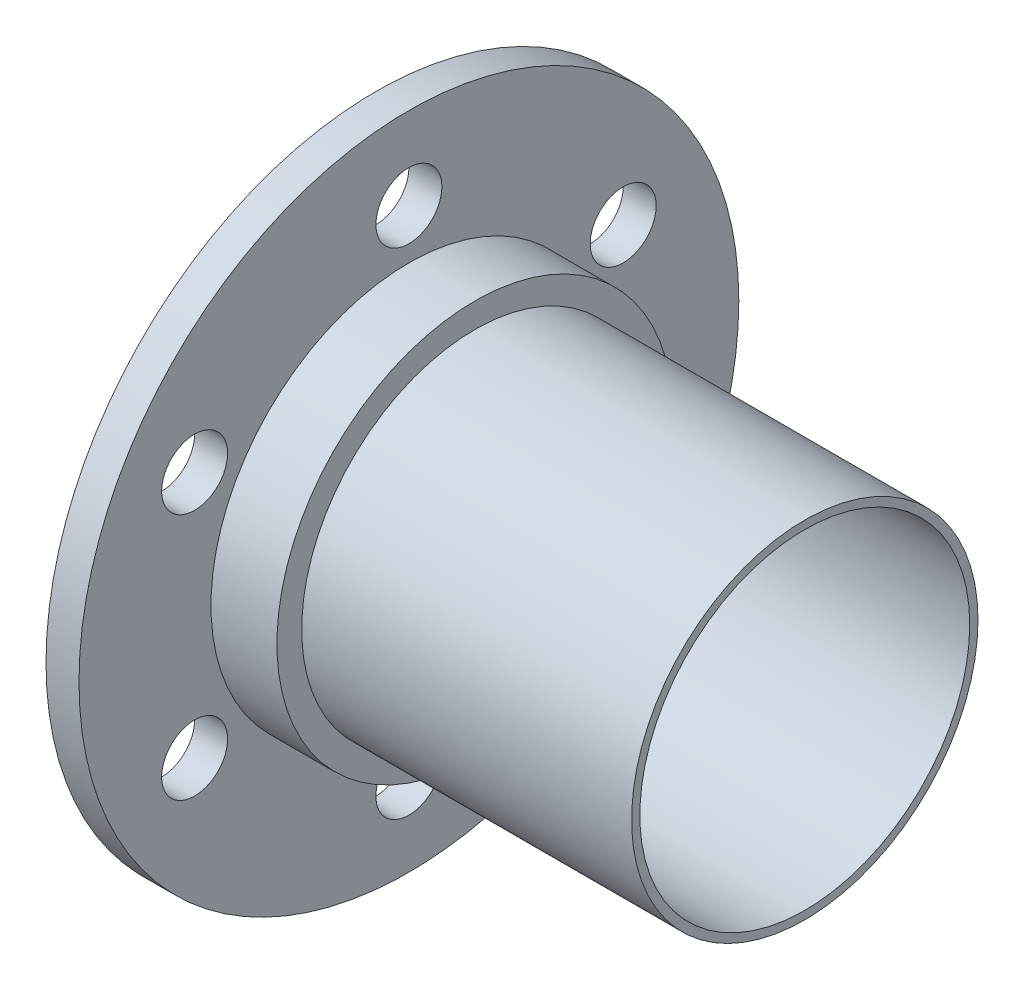
ISO-10303-21;
HEADER;
FILE_DESCRIPTION(('STEP AP214'),'2;1');
FILE_NAME('part.step','',(''),(''),'','','');
FILE_SCHEMA(('AUTOMOTIVE_DESIGN { 1 0 10303 214 1 1 1 1 }'));
ENDSEC;
DATA;
#1=APPLICATION_CONTEXT('core data for automotive mechanical design processes');
#2=APPLICATION_PROTOCOL_DEFINITION('international standard','automotive_design',2000,#1);
#3=PRODUCT_CONTEXT('',#1,'mechanical');
#4=PRODUCT('Part','Part','',(#3));
#5=PRODUCT_RELATED_PRODUCT_CATEGORY('part','',(#4));
#6=PRODUCT_DEFINITION_FORMATION('','',#4);
#7=PRODUCT_DEFINITION_CONTEXT('part definition',#1,'design');
#8=PRODUCT_DEFINITION('design','',#6,#7);
#9=PRODUCT_DEFINITION_SHAPE('','',#8);
#10=(LENGTH_UNIT() NAMED_UNIT(*) SI_UNIT(.MILLI.,.METRE.));
#11=(NAMED_UNIT(*) PLANE_ANGLE_UNIT() SI_UNIT($,.RADIAN.));
#12=(NAMED_UNIT(*) SI_UNIT($,.STERADIAN.) SOLID_ANGLE_UNIT());
#13=UNCERTAINTY_MEASURE_WITH_UNIT(LENGTH_MEASURE(1.E-05),#10,'distance_accuracy_value','');
#14=(GEOMETRIC_REPRESENTATION_CONTEXT(3) GLOBAL_UNCERTAINTY_ASSIGNED_CONTEXT((#13)) GLOBAL_UNIT_ASSIGNED_CONTEXT((#10,
#11,#12)) REPRESENTATION_CONTEXT('',''));
#15=CARTESIAN_POINT('',(0.,0.,0.));
#16=DIRECTION('',(0.,0.,1.));
#17=DIRECTION('',(1.,0.,0.));
#18=AXIS2_PLACEMENT_3D('',#15,#16,#17);
#19=CARTESIAN_POINT('',(120.,0.,0.));
#20=DIRECTION('',(1.,0.,0.));
#21=DIRECTION('',(0.,0.,-1.));
#22=AXIS2_PLACEMENT_3D('',#19,#20,#21);
#23=PLANE('',#22);
#24=CARTESIAN_POINT('',(120.,0.,0.));
#25=DIRECTION('',(1.,0.,0.));
#26=DIRECTION('',(0.,0.,-1.));
#27=AXIS2_PLACEMENT_3D('',#24,#25,#26);
#28=CIRCLE('',#27,52.5);
#29=CARTESIAN_POINT('',(120.,0.,-52.5));
#30=VERTEX_POINT('',#29);
#31=EDGE_CURVE('E11',#30,#30,#28,.T.);
#32=ORIENTED_EDGE('',*,*,#31,.T.);
#33=EDGE_LOOP('',(#32));
#34=FACE_BOUND('',#33,.T.);
#35=CARTESIAN_POINT('',(120.,0.,0.));
#36=DIRECTION('',(1.,0.,0.));
#37=DIRECTION('',(0.,0.,-1.));
#38=AXIS2_PLACEMENT_3D('',#35,#36,#37);
#39=CIRCLE('',#38,50.);
#40=CARTESIAN_POINT('',(120.,0.,-50.));
#41=VERTEX_POINT('',#40);
#42=EDGE_CURVE('E54',#41,#41,#39,.T.);
#43=ORIENTED_EDGE('',*,*,#42,.F.);
#44=EDGE_LOOP('',(#43));
#45=FACE_BOUND('',#44,.T.);
#46=ADVANCED_FACE('F43',(#34,#45),#23,.T.);
#47=CARTESIAN_POINT('',(20.,0.,0.));
#48=DIRECTION('',(1.,0.,0.));
#49=DIRECTION('',(0.,0.,-1.));
#50=AXIS2_PLACEMENT_3D('',#47,#48,#49);
#51=PLANE('',#50);
#52=CARTESIAN_POINT('',(20.,0.,0.));
#53=DIRECTION('',(1.,0.,0.));
#54=DIRECTION('',(0.,0.,-1.));
#55=AXIS2_PLACEMENT_3D('',#52,#53,#54);
#56=CIRCLE('',#55,52.5);
#57=CARTESIAN_POINT('',(20.,0.,-52.5));
#58=VERTEX_POINT('',#57);
#59=EDGE_CURVE('E47',#58,#58,#56,.T.);
#60=ORIENTED_EDGE('',*,*,#59,.F.);
#61=EDGE_LOOP('',(#60));
#62=FACE_BOUND('',#61,.T.);
#63=CARTESIAN_POINT('',(20.,0.,0.));
#64=DIRECTION('',(1.,0.,0.));
#65=DIRECTION('',(0.,0.,-1.));
#66=AXIS2_PLACEMENT_3D('',#63,#64,#65);
#67=CIRCLE('',#66,50.);
#68=CARTESIAN_POINT('',(20.,0.,-50.));
#69=VERTEX_POINT('',#68);
#70=EDGE_CURVE('E56',#69,#69,#67,.T.);
#71=ORIENTED_EDGE('',*,*,#70,.T.);
#72=EDGE_LOOP('',(#71));
#73=FACE_BOUND('',#72,.T.);
#74=ADVANCED_FACE('F66',(#62,#73),#51,.F.);
#75=CARTESIAN_POINT('',(120.,0.,0.));
#76=DIRECTION('',(-1.,0.,0.));
#77=DIRECTION('',(0.,0.,1.));
#78=AXIS2_PLACEMENT_3D('',#75,#76,#77);
#79=CYLINDRICAL_SURFACE('',#78,52.5);
#80=ORIENTED_EDGE('',*,*,#31,.F.);
#81=EDGE_LOOP('',(#80));
#82=FACE_BOUND('',#81,.T.);
#83=ORIENTED_EDGE('',*,*,#59,.T.);
#84=EDGE_LOOP('',(#83));
#85=FACE_BOUND('',#84,.T.);
#86=ADVANCED_FACE('F45',(#82,#85),#79,.T.);
#87=CARTESIAN_POINT('',(120.,0.,0.));
#88=DIRECTION('',(-1.,0.,0.));
#89=DIRECTION('',(0.,0.,1.));
#90=AXIS2_PLACEMENT_3D('',#87,#88,#89);
#91=CYLINDRICAL_SURFACE('',#90,50.);
#92=ORIENTED_EDGE('',*,*,#42,.T.);
#93=EDGE_LOOP('',(#92));
#94=FACE_BOUND('',#93,.T.);
#95=ORIENTED_EDGE('',*,*,#70,.F.);
#96=EDGE_LOOP('',(#95));
#97=FACE_BOUND('',#96,.T.);
#98=ADVANCED_FACE('F62',(#94,#97),#91,.F.);
#99=CLOSED_SHELL('',(#46,#74,#86,#98));
#100=MANIFOLD_SOLID_BREP('B2',#99);
#101=CARTESIAN_POINT('',(0.,0.,0.));
#102=DIRECTION('',(1.,0.,0.));
#103=DIRECTION('',(0.,0.,-1.));
#104=AXIS2_PLACEMENT_3D('',#101,#102,#103);
#105=PLANE('',#104);
#106=CARTESIAN_POINT('',(0.,0.,0.));
#107=DIRECTION('',(1.,0.,0.));
#108=DIRECTION('',(0.,0.,-1.));
#109=AXIS2_PLACEMENT_3D('',#106,#107,#108);
#110=CIRCLE('',#109,100.);
#111=CARTESIAN_POINT('',(0.,0.,-100.));
#112=VERTEX_POINT('',#111);
#113=EDGE_CURVE('E117',#112,#112,#110,.T.);
#114=ORIENTED_EDGE('',*,*,#113,.T.);
#115=EDGE_LOOP('',(#114));
#116=FACE_BOUND('',#115,.T.);
#117=CARTESIAN_POINT('',(0.,75.,0.));
#118=DIRECTION('',(1.,0.,0.));
#119=DIRECTION('',(0.,0.,-1.));
#120=AXIS2_PLACEMENT_3D('',#117,#118,#119);
#121=CIRCLE('',#120,10.);
#122=CARTESIAN_POINT('',(0.,75.,-10.));
#123=VERTEX_POINT('',#122);
#124=EDGE_CURVE('E129',#123,#123,#121,.T.);
#125=ORIENTED_EDGE('',*,*,#124,.F.);
#126=EDGE_LOOP('',(#125));
#127=FACE_BOUND('',#126,.T.);
#128=CARTESIAN_POINT('',(0.,37.5000000000028,-64.9519052838345));
#129=DIRECTION('',(1.,0.,0.));
#130=DIRECTION('',(0.,0.,-1.));
#131=AXIS2_PLACEMENT_3D('',#128,#129,#130);
#132=CIRCLE('',#131,10.0000000000009);
#133=CARTESIAN_POINT('',(0.,37.5000000000028,-74.9519052838354));
#134=VERTEX_POINT('',#133);
#135=EDGE_CURVE('E135',#134,#134,#132,.T.);
#136=ORIENTED_EDGE('',*,*,#135,.F.);
#137=EDGE_LOOP('',(#136));
#138=FACE_BOUND('',#137,.T.);
#139=CARTESIAN_POINT('',(0.,-37.4999999999972,-64.9519052838377));
#140=DIRECTION('',(1.,0.,0.));
#141=DIRECTION('',(0.,0.,-1.));
#142=AXIS2_PLACEMENT_3D('',#139,#140,#141);
#143=CIRCLE('',#142,10.0000000000041);
#144=CARTESIAN_POINT('',(0.,-37.4999999999972,-74.9519052838418));
#145=VERTEX_POINT('',#144);
#146=EDGE_CURVE('E141',#145,#145,#143,.T.);
#147=ORIENTED_EDGE('',*,*,#146,.F.);
#148=EDGE_LOOP('',(#147));
#149=FACE_BOUND('',#148,.T.);
#150=CARTESIAN_POINT('',(0.,-75.,-6.36733006886009E-12));
#151=DIRECTION('',(1.,0.,0.));
#152=DIRECTION('',(0.,0.,-1.));
#153=AXIS2_PLACEMENT_3D('',#150,#151,#152);
#154=CIRCLE('',#153,10.0000000000066);
#155=CARTESIAN_POINT('',(0.,-75.,-10.000000000013));
#156=VERTEX_POINT('',#155);
#157=EDGE_CURVE('E147',#156,#156,#154,.T.);
#158=ORIENTED_EDGE('',*,*,#157,.F.);
#159=EDGE_LOOP('',(#158));
#160=FACE_BOUND('',#159,.T.);
#161=CARTESIAN_POINT('',(0.,-37.5000000000028,64.9519052838281));
#162=DIRECTION('',(1.,0.,0.));
#163=DIRECTION('',(0.,0.,-1.));
#164=AXIS2_PLACEMENT_3D('',#161,#162,#163);
#165=CIRCLE('',#164,10.0000000000061);
#166=CARTESIAN_POINT('',(0.,-37.5000000000028,54.9519052838221));
#167=VERTEX_POINT('',#166);
#168=EDGE_CURVE('E153',#167,#167,#165,.T.);
#169=ORIENTED_EDGE('',*,*,#168,.F.);
#170=EDGE_LOOP('',(#169));
#171=FACE_BOUND('',#170,.T.);
#172=CARTESIAN_POINT('',(0.,37.4999999999972,64.9519052838313));
#173=DIRECTION('',(1.,0.,0.));
#174=DIRECTION('',(0.,0.,-1.));
#175=AXIS2_PLACEMENT_3D('',#172,#173,#174);
#176=CIRCLE('',#175,10.0000000000032);
#177=CARTESIAN_POINT('',(0.,37.4999999999972,54.9519052838281));
#178=VERTEX_POINT('',#177);
#179=EDGE_CURVE('E159',#178,#178,#176,.T.);
#180=ORIENTED_EDGE('',*,*,#179,.F.);
#181=EDGE_LOOP('',(#180));
#182=FACE_BOUND('',#181,.T.);
#183=CARTESIAN_POINT('',(0.,0.,0.));
#184=DIRECTION('',(1.,0.,0.));
#185=DIRECTION('',(0.,0.,-1.));
#186=AXIS2_PLACEMENT_3D('',#183,#184,#185);
#187=CIRCLE('',#186,60.);
#188=CARTESIAN_POINT('',(0.,0.,-60.));
#189=VERTEX_POINT('',#188);
#190=EDGE_CURVE('E165',#189,#189,#187,.T.);
#191=ORIENTED_EDGE('',*,*,#190,.F.);
#192=EDGE_LOOP('',(#191));
#193=FACE_BOUND('',#192,.T.);
#194=ADVANCED_FACE('F113',(#116,#127,#138,#149,#160,#171,#182,#193),#105,.T.);
#195=CARTESIAN_POINT('',(-10.,0.,0.));
#196=DIRECTION('',(1.,0.,0.));
#197=DIRECTION('',(0.,0.,-1.));
#198=AXIS2_PLACEMENT_3D('',#195,#196,#197);
#199=CYLINDRICAL_SURFACE('',#198,100.);
#200=CARTESIAN_POINT('',(-10.,0.,0.));
#201=DIRECTION('',(1.,0.,0.));
#202=DIRECTION('',(0.,0.,-1.));
#203=AXIS2_PLACEMENT_3D('',#200,#201,#202);
#204=CIRCLE('',#203,100.);
#205=CARTESIAN_POINT('',(-10.,0.,-100.));
#206=VERTEX_POINT('',#205);
#207=EDGE_CURVE('E42',#206,#206,#204,.T.);
#208=ORIENTED_EDGE('',*,*,#207,.T.);
#209=EDGE_LOOP('',(#208));
#210=FACE_BOUND('',#209,.T.);
#211=ORIENTED_EDGE('',*,*,#113,.F.);
#212=EDGE_LOOP('',(#211));
#213=FACE_BOUND('',#212,.T.);
#214=ADVANCED_FACE('F115',(#210,#213),#199,.T.);
#215=CARTESIAN_POINT('',(-10.,0.,0.));
#216=DIRECTION('',(1.,0.,0.));
#217=DIRECTION('',(0.,0.,-1.));
#218=AXIS2_PLACEMENT_3D('',#215,#216,#217);
#219=PLANE('',#218);
#220=CARTESIAN_POINT('',(-10.,37.4999999999972,64.9519052838313));
#221=DIRECTION('',(1.,0.,0.));
#222=DIRECTION('',(0.,0.,-1.));
#223=AXIS2_PLACEMENT_3D('',#220,#221,#222);
#224=CIRCLE('',#223,10.0000000000032);
#225=CARTESIAN_POINT('',(-10.,37.4999999999972,54.9519052838281));
#226=VERTEX_POINT('',#225);
#227=EDGE_CURVE('E156',#226,#226,#224,.T.);
#228=ORIENTED_EDGE('',*,*,#227,.T.);
#229=EDGE_LOOP('',(#228));
#230=FACE_BOUND('',#229,.T.);
#231=CARTESIAN_POINT('',(-10.,-37.5000000000028,64.9519052838281));
#232=DIRECTION('',(1.,0.,0.));
#233=DIRECTION('',(0.,0.,-1.));
#234=AXIS2_PLACEMENT_3D('',#231,#232,#233);
#235=CIRCLE('',#234,10.0000000000061);
#236=CARTESIAN_POINT('',(-10.,-37.5000000000028,54.9519052838221));
#237=VERTEX_POINT('',#236);
#238=EDGE_CURVE('E150',#237,#237,#235,.T.);
#239=ORIENTED_EDGE('',*,*,#238,.T.);
#240=EDGE_LOOP('',(#239));
#241=FACE_BOUND('',#240,.T.);
#242=CARTESIAN_POINT('',(-10.,-75.,-6.36733006886009E-12));
#243=DIRECTION('',(1.,0.,0.));
#244=DIRECTION('',(0.,0.,-1.));
#245=AXIS2_PLACEMENT_3D('',#242,#243,#244);
#246=CIRCLE('',#245,10.0000000000066);
#247=CARTESIAN_POINT('',(-10.,-75.,-10.000000000013));
#248=VERTEX_POINT('',#247);
#249=EDGE_CURVE('E144',#248,#248,#246,.T.);
#250=ORIENTED_EDGE('',*,*,#249,.T.);
#251=EDGE_LOOP('',(#250));
#252=FACE_BOUND('',#251,.T.);
#253=CARTESIAN_POINT('',(-10.,-37.4999999999972,-64.9519052838377));
#254=DIRECTION('',(1.,0.,0.));
#255=DIRECTION('',(0.,0.,-1.));
#256=AXIS2_PLACEMENT_3D('',#253,#254,#255);
#257=CIRCLE('',#256,10.0000000000041);
#258=CARTESIAN_POINT('',(-10.,-37.4999999999972,-74.9519052838418));
#259=VERTEX_POINT('',#258);
#260=EDGE_CURVE('E138',#259,#259,#257,.T.);
#261=ORIENTED_EDGE('',*,*,#260,.T.);
#262=EDGE_LOOP('',(#261));
#263=FACE_BOUND('',#262,.T.);
#264=CARTESIAN_POINT('',(-10.,37.5000000000028,-64.9519052838345));
#265=DIRECTION('',(1.,0.,0.));
#266=DIRECTION('',(0.,0.,-1.));
#267=AXIS2_PLACEMENT_3D('',#264,#265,#266);
#268=CIRCLE('',#267,10.0000000000009);
#269=CARTESIAN_POINT('',(-10.,37.5000000000028,-74.9519052838354));
#270=VERTEX_POINT('',#269);
#271=EDGE_CURVE('E132',#270,#270,#268,.T.);
#272=ORIENTED_EDGE('',*,*,#271,.T.);
#273=EDGE_LOOP('',(#272));
#274=FACE_BOUND('',#273,.T.);
#275=CARTESIAN_POINT('',(-10.,75.,0.));
#276=DIRECTION('',(1.,0.,0.));
#277=DIRECTION('',(0.,0.,-1.));
#278=AXIS2_PLACEMENT_3D('',#275,#276,#277);
#279=CIRCLE('',#278,10.);
#280=CARTESIAN_POINT('',(-10.,75.,-10.));
#281=VERTEX_POINT('',#280);
#282=EDGE_CURVE('E128',#281,#281,#279,.T.);
#283=ORIENTED_EDGE('',*,*,#282,.T.);
#284=EDGE_LOOP('',(#283));
#285=FACE_BOUND('',#284,.T.);
#286=CARTESIAN_POINT('',(-10.,0.,0.));
#287=DIRECTION('',(1.,0.,0.));
#288=DIRECTION('',(0.,0.,-1.));
#289=AXIS2_PLACEMENT_3D('',#286,#287,#288);
#290=CIRCLE('',#289,52.5);
#291=CARTESIAN_POINT('',(-10.,0.,-52.5));
#292=VERTEX_POINT('',#291);
#293=EDGE_CURVE('E124',#292,#292,#290,.T.);
#294=ORIENTED_EDGE('',*,*,#293,.T.);
#295=EDGE_LOOP('',(#294));
#296=FACE_BOUND('',#295,.T.);
#297=ORIENTED_EDGE('',*,*,#207,.F.);
#298=EDGE_LOOP('',(#297));
#299=FACE_BOUND('',#298,.T.);
#300=ADVANCED_FACE('F196',(#230,#241,#252,#263,#274,#285,#296,#299),#219,.F.);
#301=CARTESIAN_POINT('',(-10.,0.,0.));
#302=DIRECTION('',(1.,0.,0.));
#303=DIRECTION('',(0.,0.,-1.));
#304=AXIS2_PLACEMENT_3D('',#301,#302,#303);
#305=CYLINDRICAL_SURFACE('',#304,52.5);
#306=ORIENTED_EDGE('',*,*,#293,.F.);
#307=EDGE_LOOP('',(#306));
#308=FACE_BOUND('',#307,.T.);
#309=CARTESIAN_POINT('',(20.,0.,0.));
#310=DIRECTION('',(1.,0.,0.));
#311=DIRECTION('',(0.,0.,-1.));
#312=AXIS2_PLACEMENT_3D('',#309,#310,#311);
#313=CIRCLE('',#312,52.5);
#314=CARTESIAN_POINT('',(20.,0.,-52.5));
#315=VERTEX_POINT('',#314);
#316=EDGE_CURVE('E168',#315,#315,#313,.T.);
#317=ORIENTED_EDGE('',*,*,#316,.T.);
#318=EDGE_LOOP('',(#317));
#319=FACE_BOUND('',#318,.T.);
#320=ADVANCED_FACE('F174',(#308,#319),#305,.F.);
#321=CARTESIAN_POINT('',(-10.,75.,0.));
#322=DIRECTION('',(1.,0.,0.));
#323=DIRECTION('',(0.,0.,-1.));
#324=AXIS2_PLACEMENT_3D('',#321,#322,#323);
#325=CYLINDRICAL_SURFACE('',#324,10.);
#326=ORIENTED_EDGE('',*,*,#282,.F.);
#327=EDGE_LOOP('',(#326));
#328=FACE_BOUND('',#327,.T.);
#329=ORIENTED_EDGE('',*,*,#124,.T.);
#330=EDGE_LOOP('',(#329));
#331=FACE_BOUND('',#330,.T.);
#332=ADVANCED_FACE('F204',(#328,#331),#325,.F.);
#333=CARTESIAN_POINT('',(-10.,37.5000000000028,-64.9519052838345));
#334=DIRECTION('',(1.,0.,0.));
#335=DIRECTION('',(0.,0.,-1.));
#336=AXIS2_PLACEMENT_3D('',#333,#334,#335);
#337=CYLINDRICAL_SURFACE('',#336,10.0000000000009);
#338=ORIENTED_EDGE('',*,*,#271,.F.);
#339=EDGE_LOOP('',(#338));
#340=FACE_BOUND('',#339,.T.);
#341=ORIENTED_EDGE('',*,*,#135,.T.);
#342=EDGE_LOOP('',(#341));
#343=FACE_BOUND('',#342,.T.);
#344=ADVANCED_FACE('F208',(#340,#343),#337,.F.);
#345=CARTESIAN_POINT('',(-10.,-37.4999999999972,-64.9519052838377));
#346=DIRECTION('',(1.,0.,0.));
#347=DIRECTION('',(0.,0.,-1.));
#348=AXIS2_PLACEMENT_3D('',#345,#346,#347);
#349=CYLINDRICAL_SURFACE('',#348,10.0000000000041);
#350=ORIENTED_EDGE('',*,*,#260,.F.);
#351=EDGE_LOOP('',(#350));
#352=FACE_BOUND('',#351,.T.);
#353=ORIENTED_EDGE('',*,*,#146,.T.);
#354=EDGE_LOOP('',(#353));
#355=FACE_BOUND('',#354,.T.);
#356=ADVANCED_FACE('F212',(#352,#355),#349,.F.);
#357=CARTESIAN_POINT('',(-10.,-75.,-6.36733006886009E-12));
#358=DIRECTION('',(1.,0.,0.));
#359=DIRECTION('',(0.,0.,-1.));
#360=AXIS2_PLACEMENT_3D('',#357,#358,#359);
#361=CYLINDRICAL_SURFACE('',#360,10.0000000000066);
#362=ORIENTED_EDGE('',*,*,#249,.F.);
#363=EDGE_LOOP('',(#362));
#364=FACE_BOUND('',#363,.T.);
#365=ORIENTED_EDGE('',*,*,#157,.T.);
#366=EDGE_LOOP('',(#365));
#367=FACE_BOUND('',#366,.T.);
#368=ADVANCED_FACE('F216',(#364,#367),#361,.F.);
#369=CARTESIAN_POINT('',(-10.,-37.5000000000028,64.9519052838281));
#370=DIRECTION('',(1.,0.,0.));
#371=DIRECTION('',(0.,0.,-1.));
#372=AXIS2_PLACEMENT_3D('',#369,#370,#371);
#373=CYLINDRICAL_SURFACE('',#372,10.0000000000061);
#374=ORIENTED_EDGE('',*,*,#238,.F.);
#375=EDGE_LOOP('',(#374));
#376=FACE_BOUND('',#375,.T.);
#377=ORIENTED_EDGE('',*,*,#168,.T.);
#378=EDGE_LOOP('',(#377));
#379=FACE_BOUND('',#378,.T.);
#380=ADVANCED_FACE('F188',(#376,#379),#373,.F.);
#381=CARTESIAN_POINT('',(-10.,37.4999999999972,64.9519052838313));
#382=DIRECTION('',(1.,0.,0.));
#383=DIRECTION('',(0.,0.,-1.));
#384=AXIS2_PLACEMENT_3D('',#381,#382,#383);
#385=CYLINDRICAL_SURFACE('',#384,10.0000000000032);
#386=ORIENTED_EDGE('',*,*,#227,.F.);
#387=EDGE_LOOP('',(#386));
#388=FACE_BOUND('',#387,.T.);
#389=ORIENTED_EDGE('',*,*,#179,.T.);
#390=EDGE_LOOP('',(#389));
#391=FACE_BOUND('',#390,.T.);
#392=ADVANCED_FACE('F179',(#388,#391),#385,.F.);
#393=CARTESIAN_POINT('',(20.,0.,0.));
#394=DIRECTION('',(1.,0.,0.));
#395=DIRECTION('',(0.,0.,-1.));
#396=AXIS2_PLACEMENT_3D('',#393,#394,#395);
#397=PLANE('',#396);
#398=CARTESIAN_POINT('',(20.,0.,0.));
#399=DIRECTION('',(1.,0.,0.));
#400=DIRECTION('',(0.,0.,-1.));
#401=AXIS2_PLACEMENT_3D('',#398,#399,#400);
#402=CIRCLE('',#401,60.);
#403=CARTESIAN_POINT('',(20.,0.,-60.));
#404=VERTEX_POINT('',#403);
#405=EDGE_CURVE('E162',#404,#404,#402,.T.);
#406=ORIENTED_EDGE('',*,*,#405,.T.);
#407=EDGE_LOOP('',(#406));
#408=FACE_BOUND('',#407,.T.);
#409=ORIENTED_EDGE('',*,*,#316,.F.);
#410=EDGE_LOOP('',(#409));
#411=FACE_BOUND('',#410,.T.);
#412=ADVANCED_FACE('F176',(#408,#411),#397,.T.);
#413=CARTESIAN_POINT('',(20.,0.,0.));
#414=DIRECTION('',(-1.,0.,0.));
#415=DIRECTION('',(0.,0.,1.));
#416=AXIS2_PLACEMENT_3D('',#413,#414,#415);
#417=CYLINDRICAL_SURFACE('',#416,60.);
#418=ORIENTED_EDGE('',*,*,#405,.F.);
#419=EDGE_LOOP('',(#418));
#420=FACE_BOUND('',#419,.T.);
#421=ORIENTED_EDGE('',*,*,#190,.T.);
#422=EDGE_LOOP('',(#421));
#423=FACE_BOUND('',#422,.T.);
#424=ADVANCED_FACE('F178',(#420,#423),#417,.T.);
#425=CLOSED_SHELL('',(#194,#214,#300,#320,#332,#344,#356,#368,#380,#392,#412,#424));
#426=MANIFOLD_SOLID_BREP('B6',#425);
#427=ADVANCED_BREP_SHAPE_REPRESENTATION('',(#18,#100,#426),#14);
#428=SHAPE_DEFINITION_REPRESENTATION(#9,#427);
ENDSEC;
END-ISO-10303-21;
